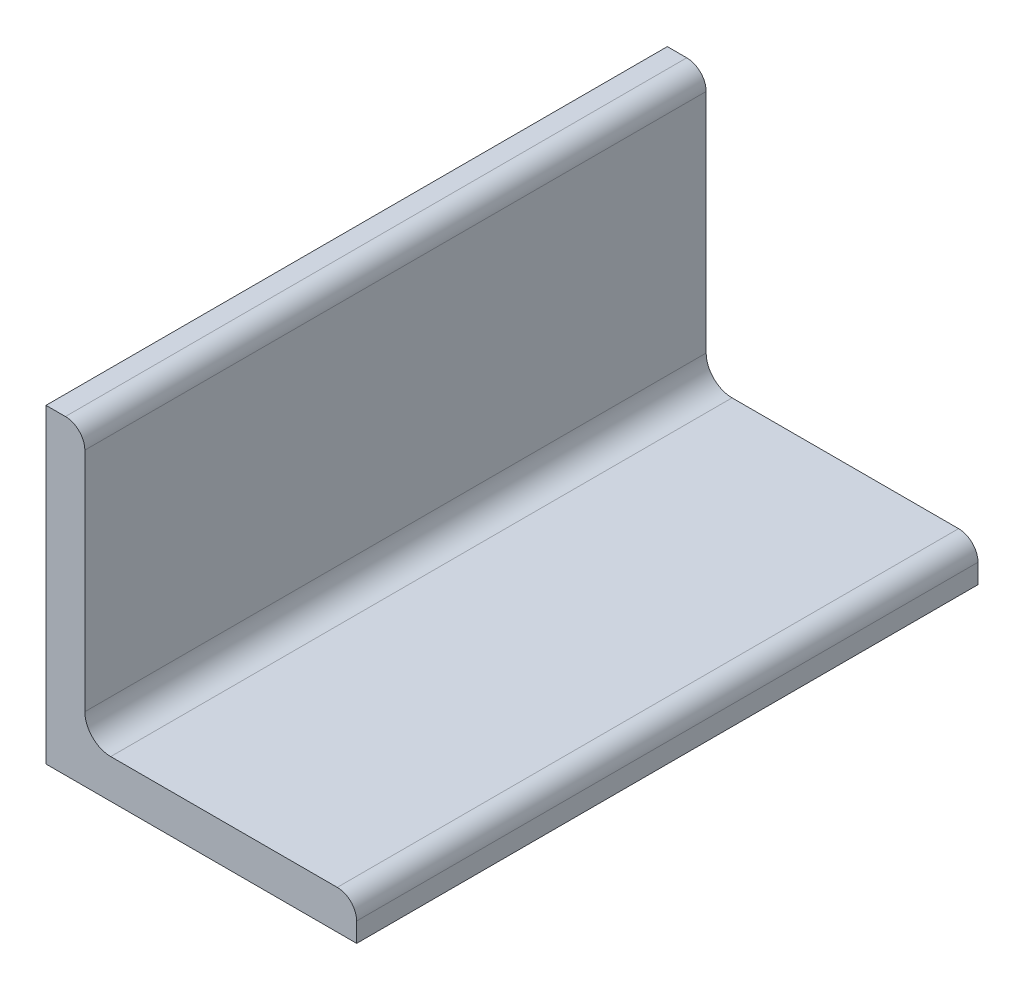
ISO-10303-21;
HEADER;
FILE_DESCRIPTION(('STEP AP214'),'2;1');
FILE_NAME('part.step','',(''),(''),'','','');
FILE_SCHEMA(('AUTOMOTIVE_DESIGN { 1 0 10303 214 1 1 1 1 }'));
ENDSEC;
DATA;
#1=APPLICATION_CONTEXT('core data for automotive mechanical design processes');
#2=APPLICATION_PROTOCOL_DEFINITION('international standard','automotive_design',2000,#1);
#3=PRODUCT_CONTEXT('',#1,'mechanical');
#4=PRODUCT('Part','Part','',(#3));
#5=PRODUCT_RELATED_PRODUCT_CATEGORY('part','',(#4));
#6=PRODUCT_DEFINITION_FORMATION('','',#4);
#7=PRODUCT_DEFINITION_CONTEXT('part definition',#1,'design');
#8=PRODUCT_DEFINITION('design','',#6,#7);
#9=PRODUCT_DEFINITION_SHAPE('','',#8);
#10=(LENGTH_UNIT() NAMED_UNIT(*) SI_UNIT(.MILLI.,.METRE.));
#11=(NAMED_UNIT(*) PLANE_ANGLE_UNIT() SI_UNIT($,.RADIAN.));
#12=(NAMED_UNIT(*) SI_UNIT($,.STERADIAN.) SOLID_ANGLE_UNIT());
#13=UNCERTAINTY_MEASURE_WITH_UNIT(LENGTH_MEASURE(1.E-05),#10,'distance_accuracy_value','');
#14=(GEOMETRIC_REPRESENTATION_CONTEXT(3) GLOBAL_UNCERTAINTY_ASSIGNED_CONTEXT((#13)) GLOBAL_UNIT_ASSIGNED_CONTEXT((#10,
#11,#12)) REPRESENTATION_CONTEXT('',''));
#15=CARTESIAN_POINT('',(0.,0.,0.));
#16=DIRECTION('',(0.,0.,1.));
#17=DIRECTION('',(1.,0.,0.));
#18=AXIS2_PLACEMENT_3D('',#15,#16,#17);
#19=CARTESIAN_POINT('',(0.425014111727251,152.925428131371,304.8));
#20=DIRECTION('',(1.,0.,0.));
#21=DIRECTION('',(0.,0.,-1.));
#22=AXIS2_PLACEMENT_3D('',#19,#20,#21);
#23=PLANE('',#22);
#24=DIRECTION('',(0.,-1.,0.));
#25=VECTOR('',#24,1.);
#26=CARTESIAN_POINT('',(0.425014111727251,152.925428131371,0.));
#27=LINE('',#26,#25);
#28=CARTESIAN_POINT('',(0.425014111727251,152.925428131371,0.));
#29=VERTEX_POINT('',#28);
#30=CARTESIAN_POINT('',(0.425014111727251,0.52542813137111,0.));
#31=VERTEX_POINT('',#30);
#32=EDGE_CURVE('E135',#29,#31,#27,.T.);
#33=ORIENTED_EDGE('',*,*,#32,.T.);
#34=DIRECTION('',(0.,0.,-1.));
#35=VECTOR('',#34,1.);
#36=CARTESIAN_POINT('',(0.425014111727251,0.52542813137111,304.8));
#37=LINE('',#36,#35);
#38=CARTESIAN_POINT('',(0.425014111727251,0.52542813137111,304.8));
#39=VERTEX_POINT('',#38);
#40=EDGE_CURVE('E11',#39,#31,#37,.T.);
#41=ORIENTED_EDGE('',*,*,#40,.F.);
#42=DIRECTION('',(0.,-1.,0.));
#43=VECTOR('',#42,1.);
#44=CARTESIAN_POINT('',(0.425014111727251,152.925428131371,304.8));
#45=LINE('',#44,#43);
#46=CARTESIAN_POINT('',(0.425014111727251,152.925428131371,304.8));
#47=VERTEX_POINT('',#46);
#48=EDGE_CURVE('E151',#47,#39,#45,.T.);
#49=ORIENTED_EDGE('',*,*,#48,.F.);
#50=DIRECTION('',(0.,0.,-1.));
#51=VECTOR('',#50,1.);
#52=CARTESIAN_POINT('',(0.425014111727251,152.925428131371,304.8));
#53=LINE('',#52,#51);
#54=EDGE_CURVE('E131',#47,#29,#53,.T.);
#55=ORIENTED_EDGE('',*,*,#54,.T.);
#56=EDGE_LOOP('',(#33,#41,#49,#55));
#57=FACE_BOUND('',#56,.T.);
#58=ADVANCED_FACE('F33',(#57),#23,.F.);
#59=CARTESIAN_POINT('',(0.425014111727251,0.52542813137111,304.8));
#60=DIRECTION('',(0.,1.,0.));
#61=DIRECTION('',(0.,0.,1.));
#62=AXIS2_PLACEMENT_3D('',#59,#60,#61);
#63=PLANE('',#62);
#64=DIRECTION('',(1.,0.,0.));
#65=VECTOR('',#64,1.);
#66=CARTESIAN_POINT('',(0.425014111727251,0.52542813137111,0.));
#67=LINE('',#66,#65);
#68=CARTESIAN_POINT('',(152.825014111727,0.52542813137111,0.));
#69=VERTEX_POINT('',#68);
#70=EDGE_CURVE('E138',#31,#69,#67,.T.);
#71=ORIENTED_EDGE('',*,*,#70,.T.);
#72=DIRECTION('',(0.,0.,-1.));
#73=VECTOR('',#72,1.);
#74=CARTESIAN_POINT('',(152.825014111727,0.52542813137111,304.8));
#75=LINE('',#74,#73);
#76=CARTESIAN_POINT('',(152.825014111727,0.52542813137111,304.8));
#77=VERTEX_POINT('',#76);
#78=EDGE_CURVE('E41',#77,#69,#75,.T.);
#79=ORIENTED_EDGE('',*,*,#78,.F.);
#80=DIRECTION('',(1.,0.,0.));
#81=VECTOR('',#80,1.);
#82=CARTESIAN_POINT('',(0.425014111727251,0.52542813137111,304.8));
#83=LINE('',#82,#81);
#84=EDGE_CURVE('E95',#39,#77,#83,.T.);
#85=ORIENTED_EDGE('',*,*,#84,.F.);
#86=ORIENTED_EDGE('',*,*,#40,.T.);
#87=EDGE_LOOP('',(#71,#79,#85,#86));
#88=FACE_BOUND('',#87,.T.);
#89=ADVANCED_FACE('F194',(#88),#63,.F.);
#90=CARTESIAN_POINT('',(152.825014111727,0.52542813137111,304.8));
#91=DIRECTION('',(-1.,0.,0.));
#92=DIRECTION('',(0.,0.,1.));
#93=AXIS2_PLACEMENT_3D('',#90,#91,#92);
#94=PLANE('',#93);
#95=DIRECTION('',(0.,1.,0.));
#96=VECTOR('',#95,1.);
#97=CARTESIAN_POINT('',(152.825014111727,0.52542813137111,0.));
#98=LINE('',#97,#96);
#99=CARTESIAN_POINT('',(152.825014111727,10.0504281313711,0.));
#100=VERTEX_POINT('',#99);
#101=EDGE_CURVE('E140',#69,#100,#98,.T.);
#102=ORIENTED_EDGE('',*,*,#101,.T.);
#103=DIRECTION('',(0.,0.,-1.));
#104=VECTOR('',#103,1.);
#105=CARTESIAN_POINT('',(152.825014111727,10.0504281313711,304.8));
#106=LINE('',#105,#104);
#107=CARTESIAN_POINT('',(152.825014111727,10.0504281313711,304.8));
#108=VERTEX_POINT('',#107);
#109=EDGE_CURVE('E161',#108,#100,#106,.T.);
#110=ORIENTED_EDGE('',*,*,#109,.F.);
#111=DIRECTION('',(0.,1.,0.));
#112=VECTOR('',#111,1.);
#113=CARTESIAN_POINT('',(152.825014111727,0.52542813137111,304.8));
#114=LINE('',#113,#112);
#115=EDGE_CURVE('E169',#77,#108,#114,.T.);
#116=ORIENTED_EDGE('',*,*,#115,.F.);
#117=ORIENTED_EDGE('',*,*,#78,.T.);
#118=EDGE_LOOP('',(#102,#110,#116,#117));
#119=FACE_BOUND('',#118,.T.);
#120=ADVANCED_FACE('F167',(#119),#94,.F.);
#121=CARTESIAN_POINT('',(143.300014111727,10.0504281313711,304.8));
#122=DIRECTION('',(0.,0.,-1.));
#123=DIRECTION('',(-1.,0.,0.));
#124=AXIS2_PLACEMENT_3D('',#121,#122,#123);
#125=CYLINDRICAL_SURFACE('',#124,9.52500000000001);
#126=CARTESIAN_POINT('',(143.300014111727,10.0504281313711,0.));
#127=DIRECTION('',(0.,0.,1.));
#128=DIRECTION('',(1.,0.,0.));
#129=AXIS2_PLACEMENT_3D('',#126,#127,#128);
#130=CIRCLE('',#129,9.52500000000001);
#131=CARTESIAN_POINT('',(143.300014111727,19.5754281313711,0.));
#132=VERTEX_POINT('',#131);
#133=EDGE_CURVE('E142',#100,#132,#130,.T.);
#134=ORIENTED_EDGE('',*,*,#133,.T.);
#135=DIRECTION('',(0.,0.,-1.));
#136=VECTOR('',#135,1.);
#137=CARTESIAN_POINT('',(143.300014111727,19.5754281313711,304.8));
#138=LINE('',#137,#136);
#139=CARTESIAN_POINT('',(143.300014111727,19.5754281313711,304.8));
#140=VERTEX_POINT('',#139);
#141=EDGE_CURVE('E158',#140,#132,#138,.T.);
#142=ORIENTED_EDGE('',*,*,#141,.F.);
#143=CARTESIAN_POINT('',(143.300014111727,10.0504281313711,304.8));
#144=DIRECTION('',(0.,0.,1.));
#145=DIRECTION('',(1.,0.,0.));
#146=AXIS2_PLACEMENT_3D('',#143,#144,#145);
#147=CIRCLE('',#146,9.52500000000001);
#148=EDGE_CURVE('E185',#108,#140,#147,.T.);
#149=ORIENTED_EDGE('',*,*,#148,.F.);
#150=ORIENTED_EDGE('',*,*,#109,.T.);
#151=EDGE_LOOP('',(#134,#142,#149,#150));
#152=FACE_BOUND('',#151,.T.);
#153=ADVANCED_FACE('F178',(#152),#125,.T.);
#154=CARTESIAN_POINT('',(143.300014111727,19.5754281313711,304.8));
#155=DIRECTION('',(0.,-1.,0.));
#156=DIRECTION('',(0.,0.,-1.));
#157=AXIS2_PLACEMENT_3D('',#154,#155,#156);
#158=PLANE('',#157);
#159=DIRECTION('',(-1.,0.,0.));
#160=VECTOR('',#159,1.);
#161=CARTESIAN_POINT('',(143.300014111727,19.5754281313711,0.));
#162=LINE('',#161,#160);
#163=CARTESIAN_POINT('',(32.1750141117273,19.5754281313711,0.));
#164=VERTEX_POINT('',#163);
#165=EDGE_CURVE('E144',#132,#164,#162,.T.);
#166=ORIENTED_EDGE('',*,*,#165,.T.);
#167=DIRECTION('',(0.,0.,-1.));
#168=VECTOR('',#167,1.);
#169=CARTESIAN_POINT('',(32.1750141117273,19.5754281313711,304.8));
#170=LINE('',#169,#168);
#171=CARTESIAN_POINT('',(32.1750141117273,19.5754281313711,304.8));
#172=VERTEX_POINT('',#171);
#173=EDGE_CURVE('E155',#172,#164,#170,.T.);
#174=ORIENTED_EDGE('',*,*,#173,.F.);
#175=DIRECTION('',(-1.,0.,0.));
#176=VECTOR('',#175,1.);
#177=CARTESIAN_POINT('',(143.300014111727,19.5754281313711,304.8));
#178=LINE('',#177,#176);
#179=EDGE_CURVE('E184',#140,#172,#178,.T.);
#180=ORIENTED_EDGE('',*,*,#179,.F.);
#181=ORIENTED_EDGE('',*,*,#141,.T.);
#182=EDGE_LOOP('',(#166,#174,#180,#181));
#183=FACE_BOUND('',#182,.T.);
#184=ADVANCED_FACE('F182',(#183),#158,.F.);
#185=CARTESIAN_POINT('',(32.1750141117272,32.2754281313711,304.8));
#186=DIRECTION('',(0.,0.,-1.));
#187=DIRECTION('',(-1.,0.,0.));
#188=AXIS2_PLACEMENT_3D('',#185,#186,#187);
#189=CYLINDRICAL_SURFACE('',#188,12.7);
#190=CARTESIAN_POINT('',(32.1750141117272,32.2754281313711,0.));
#191=DIRECTION('',(0.,0.,-1.));
#192=DIRECTION('',(1.,0.,0.));
#193=AXIS2_PLACEMENT_3D('',#190,#191,#192);
#194=CIRCLE('',#193,12.7);
#195=CARTESIAN_POINT('',(19.4750141117273,32.2754281313711,0.));
#196=VERTEX_POINT('',#195);
#197=EDGE_CURVE('E146',#164,#196,#194,.T.);
#198=ORIENTED_EDGE('',*,*,#197,.T.);
#199=DIRECTION('',(0.,0.,-1.));
#200=VECTOR('',#199,1.);
#201=CARTESIAN_POINT('',(19.4750141117273,32.2754281313711,304.8));
#202=LINE('',#201,#200);
#203=CARTESIAN_POINT('',(19.4750141117273,32.2754281313711,304.8));
#204=VERTEX_POINT('',#203);
#205=EDGE_CURVE('E126',#204,#196,#202,.T.);
#206=ORIENTED_EDGE('',*,*,#205,.F.);
#207=CARTESIAN_POINT('',(32.1750141117272,32.2754281313711,304.8));
#208=DIRECTION('',(0.,0.,-1.));
#209=DIRECTION('',(1.,0.,0.));
#210=AXIS2_PLACEMENT_3D('',#207,#208,#209);
#211=CIRCLE('',#210,12.7);
#212=EDGE_CURVE('E117',#172,#204,#211,.T.);
#213=ORIENTED_EDGE('',*,*,#212,.F.);
#214=ORIENTED_EDGE('',*,*,#173,.T.);
#215=EDGE_LOOP('',(#198,#206,#213,#214));
#216=FACE_BOUND('',#215,.T.);
#217=ADVANCED_FACE('F206',(#216),#189,.F.);
#218=CARTESIAN_POINT('',(19.4750141117273,32.2754281313711,304.8));
#219=DIRECTION('',(-1.,0.,0.));
#220=DIRECTION('',(0.,0.,1.));
#221=AXIS2_PLACEMENT_3D('',#218,#219,#220);
#222=PLANE('',#221);
#223=DIRECTION('',(0.,1.,0.));
#224=VECTOR('',#223,1.);
#225=CARTESIAN_POINT('',(19.4750141117273,32.2754281313711,0.));
#226=LINE('',#225,#224);
#227=CARTESIAN_POINT('',(19.4750141117273,143.400428131371,0.));
#228=VERTEX_POINT('',#227);
#229=EDGE_CURVE('E125',#196,#228,#226,.T.);
#230=ORIENTED_EDGE('',*,*,#229,.T.);
#231=DIRECTION('',(0.,0.,-1.));
#232=VECTOR('',#231,1.);
#233=CARTESIAN_POINT('',(19.4750141117273,143.400428131371,304.8));
#234=LINE('',#233,#232);
#235=CARTESIAN_POINT('',(19.4750141117273,143.400428131371,304.8));
#236=VERTEX_POINT('',#235);
#237=EDGE_CURVE('E122',#236,#228,#234,.T.);
#238=ORIENTED_EDGE('',*,*,#237,.F.);
#239=DIRECTION('',(0.,1.,0.));
#240=VECTOR('',#239,1.);
#241=CARTESIAN_POINT('',(19.4750141117273,32.2754281313711,304.8));
#242=LINE('',#241,#240);
#243=EDGE_CURVE('E111',#204,#236,#242,.T.);
#244=ORIENTED_EDGE('',*,*,#243,.F.);
#245=ORIENTED_EDGE('',*,*,#205,.T.);
#246=EDGE_LOOP('',(#230,#238,#244,#245));
#247=FACE_BOUND('',#246,.T.);
#248=ADVANCED_FACE('F123',(#247),#222,.F.);
#249=CARTESIAN_POINT('',(9.95001411172725,143.400428131371,304.8));
#250=DIRECTION('',(0.,0.,-1.));
#251=DIRECTION('',(-1.,0.,0.));
#252=AXIS2_PLACEMENT_3D('',#249,#250,#251);
#253=CYLINDRICAL_SURFACE('',#252,9.52500000000001);
#254=CARTESIAN_POINT('',(9.95001411172725,143.400428131371,0.));
#255=DIRECTION('',(0.,0.,1.));
#256=DIRECTION('',(1.,0.,0.));
#257=AXIS2_PLACEMENT_3D('',#254,#255,#256);
#258=CIRCLE('',#257,9.52500000000001);
#259=CARTESIAN_POINT('',(9.95001411172725,152.925428131371,0.));
#260=VERTEX_POINT('',#259);
#261=EDGE_CURVE('E81',#228,#260,#258,.T.);
#262=ORIENTED_EDGE('',*,*,#261,.T.);
#263=DIRECTION('',(0.,0.,-1.));
#264=VECTOR('',#263,1.);
#265=CARTESIAN_POINT('',(9.95001411172725,152.925428131371,304.8));
#266=LINE('',#265,#264);
#267=CARTESIAN_POINT('',(9.95001411172725,152.925428131371,304.8));
#268=VERTEX_POINT('',#267);
#269=EDGE_CURVE('E127',#268,#260,#266,.T.);
#270=ORIENTED_EDGE('',*,*,#269,.F.);
#271=CARTESIAN_POINT('',(9.95001411172725,143.400428131371,304.8));
#272=DIRECTION('',(0.,0.,1.));
#273=DIRECTION('',(1.,0.,0.));
#274=AXIS2_PLACEMENT_3D('',#271,#272,#273);
#275=CIRCLE('',#274,9.52500000000001);
#276=EDGE_CURVE('E115',#236,#268,#275,.T.);
#277=ORIENTED_EDGE('',*,*,#276,.F.);
#278=ORIENTED_EDGE('',*,*,#237,.T.);
#279=EDGE_LOOP('',(#262,#270,#277,#278));
#280=FACE_BOUND('',#279,.T.);
#281=ADVANCED_FACE('F129',(#280),#253,.T.);
#282=CARTESIAN_POINT('',(9.95001411172725,152.925428131371,304.8));
#283=DIRECTION('',(0.,-1.,0.));
#284=DIRECTION('',(0.,0.,-1.));
#285=AXIS2_PLACEMENT_3D('',#282,#283,#284);
#286=PLANE('',#285);
#287=DIRECTION('',(-1.,0.,0.));
#288=VECTOR('',#287,1.);
#289=CARTESIAN_POINT('',(9.95001411172725,152.925428131371,0.));
#290=LINE('',#289,#288);
#291=EDGE_CURVE('E87',#260,#29,#290,.T.);
#292=ORIENTED_EDGE('',*,*,#291,.T.);
#293=ORIENTED_EDGE('',*,*,#54,.F.);
#294=DIRECTION('',(-1.,0.,0.));
#295=VECTOR('',#294,1.);
#296=CARTESIAN_POINT('',(9.95001411172725,152.925428131371,304.8));
#297=LINE('',#296,#295);
#298=EDGE_CURVE('E49',#268,#47,#297,.T.);
#299=ORIENTED_EDGE('',*,*,#298,.F.);
#300=ORIENTED_EDGE('',*,*,#269,.T.);
#301=EDGE_LOOP('',(#292,#293,#299,#300));
#302=FACE_BOUND('',#301,.T.);
#303=ADVANCED_FACE('F214',(#302),#286,.F.);
#304=CARTESIAN_POINT('',(143.300014111727,10.0504281313711,304.8));
#305=DIRECTION('',(0.,0.,1.));
#306=DIRECTION('',(1.,0.,0.));
#307=AXIS2_PLACEMENT_3D('',#304,#305,#306);
#308=PLANE('',#307);
#309=ORIENTED_EDGE('',*,*,#48,.T.);
#310=ORIENTED_EDGE('',*,*,#84,.T.);
#311=ORIENTED_EDGE('',*,*,#115,.T.);
#312=ORIENTED_EDGE('',*,*,#148,.T.);
#313=ORIENTED_EDGE('',*,*,#179,.T.);
#314=ORIENTED_EDGE('',*,*,#212,.T.);
#315=ORIENTED_EDGE('',*,*,#243,.T.);
#316=ORIENTED_EDGE('',*,*,#276,.T.);
#317=ORIENTED_EDGE('',*,*,#298,.T.);
#318=EDGE_LOOP('',(#309,#310,#311,#312,#313,#314,#315,#316,#317));
#319=FACE_BOUND('',#318,.T.);
#320=ADVANCED_FACE('F113',(#319),#308,.T.);
#321=CARTESIAN_POINT('',(143.300014111727,10.0504281313711,0.));
#322=DIRECTION('',(0.,0.,1.));
#323=DIRECTION('',(1.,0.,0.));
#324=AXIS2_PLACEMENT_3D('',#321,#322,#323);
#325=PLANE('',#324);
#326=ORIENTED_EDGE('',*,*,#32,.F.);
#327=ORIENTED_EDGE('',*,*,#291,.F.);
#328=ORIENTED_EDGE('',*,*,#261,.F.);
#329=ORIENTED_EDGE('',*,*,#229,.F.);
#330=ORIENTED_EDGE('',*,*,#197,.F.);
#331=ORIENTED_EDGE('',*,*,#165,.F.);
#332=ORIENTED_EDGE('',*,*,#133,.F.);
#333=ORIENTED_EDGE('',*,*,#101,.F.);
#334=ORIENTED_EDGE('',*,*,#70,.F.);
#335=EDGE_LOOP('',(#326,#327,#328,#329,#330,#331,#332,#333,#334));
#336=FACE_BOUND('',#335,.T.);
#337=ADVANCED_FACE('F173',(#336),#325,.F.);
#338=CLOSED_SHELL('',(#58,#89,#120,#153,#184,#217,#248,#281,#303,#320,#337));
#339=MANIFOLD_SOLID_BREP('B2',#338);
#340=ADVANCED_BREP_SHAPE_REPRESENTATION('',(#18,#339),#14);
#341=SHAPE_DEFINITION_REPRESENTATION(#9,#340);
ENDSEC;
END-ISO-10303-21;
